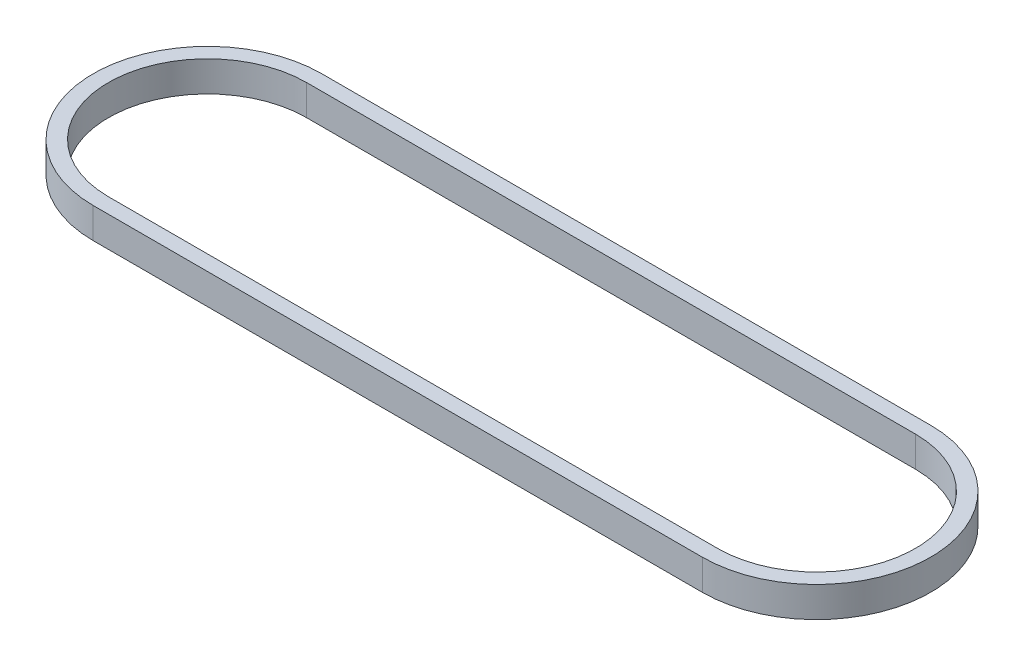
ISO-10303-21;
HEADER;
FILE_DESCRIPTION(('STEP AP214'),'2;1');
FILE_NAME('part.step','',(''),(''),'','','');
FILE_SCHEMA(('AUTOMOTIVE_DESIGN { 1 0 10303 214 1 1 1 1 }'));
ENDSEC;
DATA;
#1=APPLICATION_CONTEXT('core data for automotive mechanical design processes');
#2=APPLICATION_PROTOCOL_DEFINITION('international standard','automotive_design',2000,#1);
#3=PRODUCT_CONTEXT('',#1,'mechanical');
#4=PRODUCT('Part','Part','',(#3));
#5=PRODUCT_RELATED_PRODUCT_CATEGORY('part','',(#4));
#6=PRODUCT_DEFINITION_FORMATION('','',#4);
#7=PRODUCT_DEFINITION_CONTEXT('part definition',#1,'design');
#8=PRODUCT_DEFINITION('design','',#6,#7);
#9=PRODUCT_DEFINITION_SHAPE('','',#8);
#10=(LENGTH_UNIT() NAMED_UNIT(*) SI_UNIT(.MILLI.,.METRE.));
#11=(NAMED_UNIT(*) PLANE_ANGLE_UNIT() SI_UNIT($,.RADIAN.));
#12=(NAMED_UNIT(*) SI_UNIT($,.STERADIAN.) SOLID_ANGLE_UNIT());
#13=UNCERTAINTY_MEASURE_WITH_UNIT(LENGTH_MEASURE(1.E-05),#10,'distance_accuracy_value','');
#14=(GEOMETRIC_REPRESENTATION_CONTEXT(3) GLOBAL_UNCERTAINTY_ASSIGNED_CONTEXT((#13)) GLOBAL_UNIT_ASSIGNED_CONTEXT((#10,
#11,#12)) REPRESENTATION_CONTEXT('',''));
#15=CARTESIAN_POINT('',(0.,0.,0.));
#16=DIRECTION('',(0.,0.,1.));
#17=DIRECTION('',(1.,0.,0.));
#18=AXIS2_PLACEMENT_3D('',#15,#16,#17);
#19=CARTESIAN_POINT('',(-40.,4.,0.));
#20=DIRECTION('',(0.,1.,0.));
#21=DIRECTION('',(0.,0.,1.));
#22=AXIS2_PLACEMENT_3D('',#19,#20,#21);
#23=PLANE('',#22);
#24=CARTESIAN_POINT('',(-40.,4.,0.));
#25=DIRECTION('',(0.,1.,0.));
#26=DIRECTION('',(0.,0.,1.));
#27=AXIS2_PLACEMENT_3D('',#24,#25,#26);
#28=CIRCLE('',#27,15.);
#29=CARTESIAN_POINT('',(-40.,4.,-15.));
#30=VERTEX_POINT('',#29);
#31=CARTESIAN_POINT('',(-40.,4.,15.));
#32=VERTEX_POINT('',#31);
#33=EDGE_CURVE('E138',#30,#32,#28,.T.);
#34=ORIENTED_EDGE('',*,*,#33,.T.);
#35=DIRECTION('',(1.,0.,0.));
#36=VECTOR('',#35,1.);
#37=CARTESIAN_POINT('',(-40.,4.,15.));
#38=LINE('',#37,#36);
#39=CARTESIAN_POINT('',(40.,4.,15.));
#40=VERTEX_POINT('',#39);
#41=EDGE_CURVE('E141',#32,#40,#38,.T.);
#42=ORIENTED_EDGE('',*,*,#41,.T.);
#43=CARTESIAN_POINT('',(40.,4.,0.));
#44=DIRECTION('',(0.,1.,0.));
#45=DIRECTION('',(0.,0.,1.));
#46=AXIS2_PLACEMENT_3D('',#43,#44,#45);
#47=CIRCLE('',#46,15.);
#48=CARTESIAN_POINT('',(40.,4.,-15.));
#49=VERTEX_POINT('',#48);
#50=EDGE_CURVE('E144',#40,#49,#47,.T.);
#51=ORIENTED_EDGE('',*,*,#50,.T.);
#52=DIRECTION('',(-1.,0.,0.));
#53=VECTOR('',#52,1.);
#54=CARTESIAN_POINT('',(-40.,4.,-15.));
#55=LINE('',#54,#53);
#56=EDGE_CURVE('E146',#49,#30,#55,.T.);
#57=ORIENTED_EDGE('',*,*,#56,.T.);
#58=EDGE_LOOP('',(#34,#42,#51,#57));
#59=FACE_BOUND('',#58,.T.);
#60=DIRECTION('',(1.,0.,0.));
#61=VECTOR('',#60,1.);
#62=CARTESIAN_POINT('',(-40.,4.,13.));
#63=LINE('',#62,#61);
#64=CARTESIAN_POINT('',(-40.,4.,13.));
#65=VERTEX_POINT('',#64);
#66=CARTESIAN_POINT('',(40.,4.,13.));
#67=VERTEX_POINT('',#66);
#68=EDGE_CURVE('E110',#65,#67,#63,.T.);
#69=ORIENTED_EDGE('',*,*,#68,.F.);
#70=CARTESIAN_POINT('',(-40.,4.,0.));
#71=DIRECTION('',(0.,1.,0.));
#72=DIRECTION('',(0.,0.,1.));
#73=AXIS2_PLACEMENT_3D('',#70,#71,#72);
#74=CIRCLE('',#73,13.);
#75=CARTESIAN_POINT('',(-40.,4.,-13.));
#76=VERTEX_POINT('',#75);
#77=EDGE_CURVE('E102',#76,#65,#74,.T.);
#78=ORIENTED_EDGE('',*,*,#77,.F.);
#79=DIRECTION('',(-1.,0.,0.));
#80=VECTOR('',#79,1.);
#81=CARTESIAN_POINT('',(-40.,4.,-13.));
#82=LINE('',#81,#80);
#83=CARTESIAN_POINT('',(40.,4.,-13.));
#84=VERTEX_POINT('',#83);
#85=EDGE_CURVE('E124',#84,#76,#82,.T.);
#86=ORIENTED_EDGE('',*,*,#85,.F.);
#87=CARTESIAN_POINT('',(40.,4.,0.));
#88=DIRECTION('',(0.,1.,0.));
#89=DIRECTION('',(0.,0.,1.));
#90=AXIS2_PLACEMENT_3D('',#87,#88,#89);
#91=CIRCLE('',#90,13.);
#92=EDGE_CURVE('E122',#67,#84,#91,.T.);
#93=ORIENTED_EDGE('',*,*,#92,.F.);
#94=EDGE_LOOP('',(#69,#78,#86,#93));
#95=FACE_BOUND('',#94,.T.);
#96=ADVANCED_FACE('F37',(#59,#95),#23,.T.);
#97=CARTESIAN_POINT('',(-40.,0.,0.));
#98=DIRECTION('',(0.,1.,0.));
#99=DIRECTION('',(0.,0.,1.));
#100=AXIS2_PLACEMENT_3D('',#97,#98,#99);
#101=PLANE('',#100);
#102=CARTESIAN_POINT('',(-40.,0.,0.));
#103=DIRECTION('',(0.,1.,0.));
#104=DIRECTION('',(0.,0.,1.));
#105=AXIS2_PLACEMENT_3D('',#102,#103,#104);
#106=CIRCLE('',#105,15.);
#107=CARTESIAN_POINT('',(-40.,0.,-15.));
#108=VERTEX_POINT('',#107);
#109=CARTESIAN_POINT('',(-40.,0.,15.));
#110=VERTEX_POINT('',#109);
#111=EDGE_CURVE('E118',#108,#110,#106,.T.);
#112=ORIENTED_EDGE('',*,*,#111,.F.);
#113=DIRECTION('',(-1.,0.,0.));
#114=VECTOR('',#113,1.);
#115=CARTESIAN_POINT('',(-40.,0.,-15.));
#116=LINE('',#115,#114);
#117=CARTESIAN_POINT('',(40.,0.,-15.));
#118=VERTEX_POINT('',#117);
#119=EDGE_CURVE('E142',#118,#108,#116,.T.);
#120=ORIENTED_EDGE('',*,*,#119,.F.);
#121=CARTESIAN_POINT('',(40.,0.,0.));
#122=DIRECTION('',(0.,1.,0.));
#123=DIRECTION('',(0.,0.,1.));
#124=AXIS2_PLACEMENT_3D('',#121,#122,#123);
#125=CIRCLE('',#124,15.);
#126=CARTESIAN_POINT('',(40.,0.,15.));
#127=VERTEX_POINT('',#126);
#128=EDGE_CURVE('E153',#127,#118,#125,.T.);
#129=ORIENTED_EDGE('',*,*,#128,.F.);
#130=DIRECTION('',(1.,0.,0.));
#131=VECTOR('',#130,1.);
#132=CARTESIAN_POINT('',(-40.,0.,15.));
#133=LINE('',#132,#131);
#134=EDGE_CURVE('E151',#110,#127,#133,.T.);
#135=ORIENTED_EDGE('',*,*,#134,.F.);
#136=EDGE_LOOP('',(#112,#120,#129,#135));
#137=FACE_BOUND('',#136,.T.);
#138=CARTESIAN_POINT('',(-40.,0.,0.));
#139=DIRECTION('',(0.,1.,0.));
#140=DIRECTION('',(0.,0.,1.));
#141=AXIS2_PLACEMENT_3D('',#138,#139,#140);
#142=CIRCLE('',#141,13.);
#143=CARTESIAN_POINT('',(-40.,0.,-13.));
#144=VERTEX_POINT('',#143);
#145=CARTESIAN_POINT('',(-40.,0.,13.));
#146=VERTEX_POINT('',#145);
#147=EDGE_CURVE('E60',#144,#146,#142,.T.);
#148=ORIENTED_EDGE('',*,*,#147,.T.);
#149=DIRECTION('',(1.,0.,0.));
#150=VECTOR('',#149,1.);
#151=CARTESIAN_POINT('',(-40.,0.,13.));
#152=LINE('',#151,#150);
#153=CARTESIAN_POINT('',(40.,0.,13.));
#154=VERTEX_POINT('',#153);
#155=EDGE_CURVE('E117',#146,#154,#152,.T.);
#156=ORIENTED_EDGE('',*,*,#155,.T.);
#157=CARTESIAN_POINT('',(40.,0.,0.));
#158=DIRECTION('',(0.,1.,0.));
#159=DIRECTION('',(0.,0.,1.));
#160=AXIS2_PLACEMENT_3D('',#157,#158,#159);
#161=CIRCLE('',#160,13.);
#162=CARTESIAN_POINT('',(40.,0.,-13.));
#163=VERTEX_POINT('',#162);
#164=EDGE_CURVE('E130',#154,#163,#161,.T.);
#165=ORIENTED_EDGE('',*,*,#164,.T.);
#166=DIRECTION('',(-1.,0.,0.));
#167=VECTOR('',#166,1.);
#168=CARTESIAN_POINT('',(-40.,0.,-13.));
#169=LINE('',#168,#167);
#170=EDGE_CURVE('E111',#163,#144,#169,.T.);
#171=ORIENTED_EDGE('',*,*,#170,.T.);
#172=EDGE_LOOP('',(#148,#156,#165,#171));
#173=FACE_BOUND('',#172,.T.);
#174=ADVANCED_FACE('F171',(#137,#173),#101,.F.);
#175=CARTESIAN_POINT('',(-40.,4.,0.));
#176=DIRECTION('',(0.,-1.,0.));
#177=DIRECTION('',(0.,0.,-1.));
#178=AXIS2_PLACEMENT_3D('',#175,#176,#177);
#179=CYLINDRICAL_SURFACE('',#178,15.);
#180=ORIENTED_EDGE('',*,*,#111,.T.);
#181=DIRECTION('',(0.,-1.,0.));
#182=VECTOR('',#181,1.);
#183=CARTESIAN_POINT('',(-40.,4.,15.));
#184=LINE('',#183,#182);
#185=EDGE_CURVE('E11',#32,#110,#184,.T.);
#186=ORIENTED_EDGE('',*,*,#185,.F.);
#187=ORIENTED_EDGE('',*,*,#33,.F.);
#188=DIRECTION('',(0.,-1.,0.));
#189=VECTOR('',#188,1.);
#190=CARTESIAN_POINT('',(-40.,4.,-15.));
#191=LINE('',#190,#189);
#192=EDGE_CURVE('E148',#30,#108,#191,.T.);
#193=ORIENTED_EDGE('',*,*,#192,.T.);
#194=EDGE_LOOP('',(#180,#186,#187,#193));
#195=FACE_BOUND('',#194,.T.);
#196=ADVANCED_FACE('F39',(#195),#179,.T.);
#197=CARTESIAN_POINT('',(-40.,4.,15.));
#198=DIRECTION('',(0.,0.,-1.));
#199=DIRECTION('',(-1.,0.,0.));
#200=AXIS2_PLACEMENT_3D('',#197,#198,#199);
#201=PLANE('',#200);
#202=ORIENTED_EDGE('',*,*,#134,.T.);
#203=DIRECTION('',(0.,-1.,0.));
#204=VECTOR('',#203,1.);
#205=CARTESIAN_POINT('',(40.,4.,15.));
#206=LINE('',#205,#204);
#207=EDGE_CURVE('E45',#40,#127,#206,.T.);
#208=ORIENTED_EDGE('',*,*,#207,.F.);
#209=ORIENTED_EDGE('',*,*,#41,.F.);
#210=ORIENTED_EDGE('',*,*,#185,.T.);
#211=EDGE_LOOP('',(#202,#208,#209,#210));
#212=FACE_BOUND('',#211,.T.);
#213=ADVANCED_FACE('F181',(#212),#201,.F.);
#214=CARTESIAN_POINT('',(40.,4.,0.));
#215=DIRECTION('',(0.,-1.,0.));
#216=DIRECTION('',(0.,0.,-1.));
#217=AXIS2_PLACEMENT_3D('',#214,#215,#216);
#218=CYLINDRICAL_SURFACE('',#217,15.);
#219=ORIENTED_EDGE('',*,*,#128,.T.);
#220=DIRECTION('',(0.,-1.,0.));
#221=VECTOR('',#220,1.);
#222=CARTESIAN_POINT('',(40.,4.,-15.));
#223=LINE('',#222,#221);
#224=EDGE_CURVE('E158',#49,#118,#223,.T.);
#225=ORIENTED_EDGE('',*,*,#224,.F.);
#226=ORIENTED_EDGE('',*,*,#50,.F.);
#227=ORIENTED_EDGE('',*,*,#207,.T.);
#228=EDGE_LOOP('',(#219,#225,#226,#227));
#229=FACE_BOUND('',#228,.T.);
#230=ADVANCED_FACE('F165',(#229),#218,.T.);
#231=CARTESIAN_POINT('',(-40.,4.,-15.));
#232=DIRECTION('',(0.,0.,1.));
#233=DIRECTION('',(1.,0.,0.));
#234=AXIS2_PLACEMENT_3D('',#231,#232,#233);
#235=PLANE('',#234);
#236=ORIENTED_EDGE('',*,*,#119,.T.);
#237=ORIENTED_EDGE('',*,*,#192,.F.);
#238=ORIENTED_EDGE('',*,*,#56,.F.);
#239=ORIENTED_EDGE('',*,*,#224,.T.);
#240=EDGE_LOOP('',(#236,#237,#238,#239));
#241=FACE_BOUND('',#240,.T.);
#242=ADVANCED_FACE('F175',(#241),#235,.F.);
#243=CARTESIAN_POINT('',(-40.,4.,0.));
#244=DIRECTION('',(0.,-1.,0.));
#245=DIRECTION('',(0.,0.,-1.));
#246=AXIS2_PLACEMENT_3D('',#243,#244,#245);
#247=CYLINDRICAL_SURFACE('',#246,13.);
#248=ORIENTED_EDGE('',*,*,#147,.F.);
#249=DIRECTION('',(0.,-1.,0.));
#250=VECTOR('',#249,1.);
#251=CARTESIAN_POINT('',(-40.,4.,-13.));
#252=LINE('',#251,#250);
#253=EDGE_CURVE('E106',#76,#144,#252,.T.);
#254=ORIENTED_EDGE('',*,*,#253,.F.);
#255=ORIENTED_EDGE('',*,*,#77,.T.);
#256=DIRECTION('',(0.,-1.,0.));
#257=VECTOR('',#256,1.);
#258=CARTESIAN_POINT('',(-40.,4.,13.));
#259=LINE('',#258,#257);
#260=EDGE_CURVE('E105',#65,#146,#259,.T.);
#261=ORIENTED_EDGE('',*,*,#260,.T.);
#262=EDGE_LOOP('',(#248,#254,#255,#261));
#263=FACE_BOUND('',#262,.T.);
#264=ADVANCED_FACE('F104',(#263),#247,.F.);
#265=CARTESIAN_POINT('',(-40.,4.,13.));
#266=DIRECTION('',(0.,0.,-1.));
#267=DIRECTION('',(-1.,0.,0.));
#268=AXIS2_PLACEMENT_3D('',#265,#266,#267);
#269=PLANE('',#268);
#270=ORIENTED_EDGE('',*,*,#155,.F.);
#271=ORIENTED_EDGE('',*,*,#260,.F.);
#272=ORIENTED_EDGE('',*,*,#68,.T.);
#273=DIRECTION('',(0.,-1.,0.));
#274=VECTOR('',#273,1.);
#275=CARTESIAN_POINT('',(40.,4.,13.));
#276=LINE('',#275,#274);
#277=EDGE_CURVE('E119',#67,#154,#276,.T.);
#278=ORIENTED_EDGE('',*,*,#277,.T.);
#279=EDGE_LOOP('',(#270,#271,#272,#278));
#280=FACE_BOUND('',#279,.T.);
#281=ADVANCED_FACE('F114',(#280),#269,.T.);
#282=CARTESIAN_POINT('',(40.,4.,0.));
#283=DIRECTION('',(0.,-1.,0.));
#284=DIRECTION('',(0.,0.,-1.));
#285=AXIS2_PLACEMENT_3D('',#282,#283,#284);
#286=CYLINDRICAL_SURFACE('',#285,13.);
#287=ORIENTED_EDGE('',*,*,#164,.F.);
#288=ORIENTED_EDGE('',*,*,#277,.F.);
#289=ORIENTED_EDGE('',*,*,#92,.T.);
#290=DIRECTION('',(0.,-1.,0.));
#291=VECTOR('',#290,1.);
#292=CARTESIAN_POINT('',(40.,4.,-13.));
#293=LINE('',#292,#291);
#294=EDGE_CURVE('E52',#84,#163,#293,.T.);
#295=ORIENTED_EDGE('',*,*,#294,.T.);
#296=EDGE_LOOP('',(#287,#288,#289,#295));
#297=FACE_BOUND('',#296,.T.);
#298=ADVANCED_FACE('F204',(#297),#286,.F.);
#299=CARTESIAN_POINT('',(-40.,4.,-13.));
#300=DIRECTION('',(0.,0.,1.));
#301=DIRECTION('',(1.,0.,0.));
#302=AXIS2_PLACEMENT_3D('',#299,#300,#301);
#303=PLANE('',#302);
#304=ORIENTED_EDGE('',*,*,#170,.F.);
#305=ORIENTED_EDGE('',*,*,#294,.F.);
#306=ORIENTED_EDGE('',*,*,#85,.T.);
#307=ORIENTED_EDGE('',*,*,#253,.T.);
#308=EDGE_LOOP('',(#304,#305,#306,#307));
#309=FACE_BOUND('',#308,.T.);
#310=ADVANCED_FACE('F208',(#309),#303,.T.);
#311=CLOSED_SHELL('',(#96,#174,#196,#213,#230,#242,#264,#281,#298,#310));
#312=MANIFOLD_SOLID_BREP('B2',#311);
#313=ADVANCED_BREP_SHAPE_REPRESENTATION('',(#18,#312),#14);
#314=SHAPE_DEFINITION_REPRESENTATION(#9,#313);
ENDSEC;
END-ISO-10303-21;
